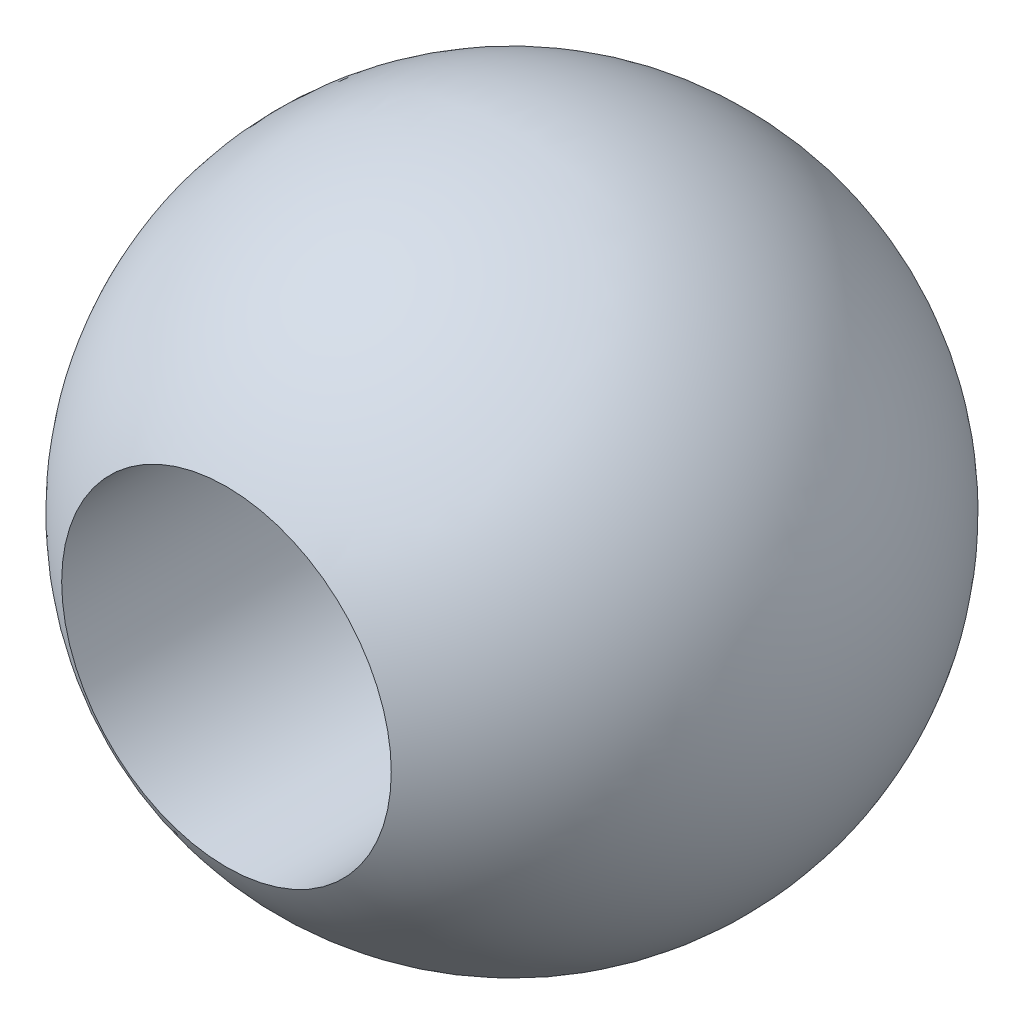
ISO-10303-21;
HEADER;
FILE_DESCRIPTION(('STEP AP214'),'2;1');
FILE_NAME('part.step','',(''),(''),'','','');
FILE_SCHEMA(('AUTOMOTIVE_DESIGN { 1 0 10303 214 1 1 1 1 }'));
ENDSEC;
DATA;
#1=APPLICATION_CONTEXT('core data for automotive mechanical design processes');
#2=APPLICATION_PROTOCOL_DEFINITION('international standard','automotive_design',2000,#1);
#3=PRODUCT_CONTEXT('',#1,'mechanical');
#4=PRODUCT('Part','Part','',(#3));
#5=PRODUCT_RELATED_PRODUCT_CATEGORY('part','',(#4));
#6=PRODUCT_DEFINITION_FORMATION('','',#4);
#7=PRODUCT_DEFINITION_CONTEXT('part definition',#1,'design');
#8=PRODUCT_DEFINITION('design','',#6,#7);
#9=PRODUCT_DEFINITION_SHAPE('','',#8);
#10=(LENGTH_UNIT() NAMED_UNIT(*) SI_UNIT(.MILLI.,.METRE.));
#11=(NAMED_UNIT(*) PLANE_ANGLE_UNIT() SI_UNIT($,.RADIAN.));
#12=(NAMED_UNIT(*) SI_UNIT($,.STERADIAN.) SOLID_ANGLE_UNIT());
#13=UNCERTAINTY_MEASURE_WITH_UNIT(LENGTH_MEASURE(1.E-05),#10,'distance_accuracy_value','');
#14=(GEOMETRIC_REPRESENTATION_CONTEXT(3) GLOBAL_UNCERTAINTY_ASSIGNED_CONTEXT((#13)) GLOBAL_UNIT_ASSIGNED_CONTEXT((#10,
#11,#12)) REPRESENTATION_CONTEXT('',''));
#15=CARTESIAN_POINT('',(0.,0.,0.));
#16=DIRECTION('',(0.,0.,1.));
#17=DIRECTION('',(1.,0.,0.));
#18=AXIS2_PLACEMENT_3D('',#15,#16,#17);
#19=CARTESIAN_POINT('',(0.,0.,-3.175));
#20=DIRECTION('',(0.,0.,1.));
#21=DIRECTION('',(1.,0.,0.));
#22=AXIS2_PLACEMENT_3D('',#19,#20,#21);
#23=CYLINDRICAL_SURFACE('',#22,1.5875);
#24=CARTESIAN_POINT('',(0.,0.,-2.74963065701559));
#25=DIRECTION('',(0.,0.,1.));
#26=DIRECTION('',(1.,0.,0.));
#27=AXIS2_PLACEMENT_3D('',#24,#25,#26);
#28=CIRCLE('',#27,1.5875);
#29=CARTESIAN_POINT('',(1.5875,0.,-2.74963065701559));
#30=VERTEX_POINT('',#29);
#31=EDGE_CURVE('E11',#30,#30,#28,.T.);
#32=ORIENTED_EDGE('',*,*,#31,.F.);
#33=EDGE_LOOP('',(#32));
#34=FACE_BOUND('',#33,.T.);
#35=CARTESIAN_POINT('',(0.,0.,2.74963065701559));
#36=DIRECTION('',(0.,0.,1.));
#37=DIRECTION('',(1.,0.,0.));
#38=AXIS2_PLACEMENT_3D('',#35,#36,#37);
#39=CIRCLE('',#38,1.5875);
#40=CARTESIAN_POINT('',(1.5875,0.,2.74963065701559));
#41=VERTEX_POINT('',#40);
#42=EDGE_CURVE('E20',#41,#41,#39,.F.);
#43=ORIENTED_EDGE('',*,*,#42,.F.);
#44=EDGE_LOOP('',(#43));
#45=FACE_BOUND('',#44,.T.);
#46=ADVANCED_FACE('F17',(#34,#45),#23,.F.);
#47=CARTESIAN_POINT('',(0.,0.,0.));
#48=DIRECTION('',(-1.,0.,0.));
#49=DIRECTION('',(0.,1.,0.));
#50=AXIS2_PLACEMENT_3D('',#47,#48,#49);
#51=SPHERICAL_SURFACE('',#50,3.175);
#52=CARTESIAN_POINT('',(3.175,0.,0.));
#53=VERTEX_POINT('',#52);
#54=VERTEX_LOOP('',#53);
#55=FACE_BOUND('',#54,.T.);
#56=CARTESIAN_POINT('',(-3.175,0.,0.));
#57=VERTEX_POINT('',#56);
#58=VERTEX_LOOP('',#57);
#59=FACE_BOUND('',#58,.T.);
#60=ORIENTED_EDGE('',*,*,#31,.T.);
#61=EDGE_LOOP('',(#60));
#62=FACE_BOUND('',#61,.T.);
#63=ORIENTED_EDGE('',*,*,#42,.T.);
#64=EDGE_LOOP('',(#63));
#65=FACE_BOUND('',#64,.T.);
#66=ADVANCED_FACE('F30',(#55,#59,#62,#65),#51,.T.);
#67=CLOSED_SHELL('',(#46,#66));
#68=MANIFOLD_SOLID_BREP('B1',#67);
#69=ADVANCED_BREP_SHAPE_REPRESENTATION('',(#18,#68),#14);
#70=SHAPE_DEFINITION_REPRESENTATION(#9,#69);
ENDSEC;
END-ISO-10303-21;
